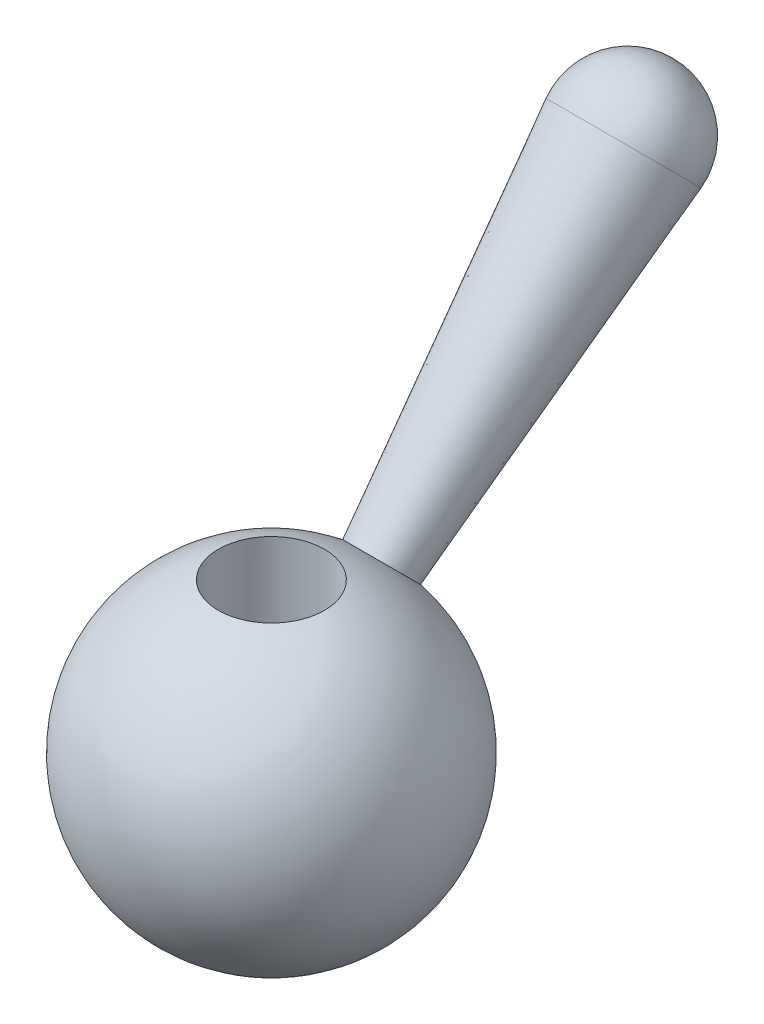
ISO-10303-21;
HEADER;
FILE_DESCRIPTION(('STEP AP214'),'2;1');
FILE_NAME('part.step','',(''),(''),'','','');
FILE_SCHEMA(('AUTOMOTIVE_DESIGN { 1 0 10303 214 1 1 1 1 }'));
ENDSEC;
DATA;
#1=APPLICATION_CONTEXT('core data for automotive mechanical design processes');
#2=APPLICATION_PROTOCOL_DEFINITION('international standard','automotive_design',2000,#1);
#3=PRODUCT_CONTEXT('',#1,'mechanical');
#4=PRODUCT('Part','Part','',(#3));
#5=PRODUCT_RELATED_PRODUCT_CATEGORY('part','',(#4));
#6=PRODUCT_DEFINITION_FORMATION('','',#4);
#7=PRODUCT_DEFINITION_CONTEXT('part definition',#1,'design');
#8=PRODUCT_DEFINITION('design','',#6,#7);
#9=PRODUCT_DEFINITION_SHAPE('','',#8);
#10=(LENGTH_UNIT() NAMED_UNIT(*) SI_UNIT(.MILLI.,.METRE.));
#11=(NAMED_UNIT(*) PLANE_ANGLE_UNIT() SI_UNIT($,.RADIAN.));
#12=(NAMED_UNIT(*) SI_UNIT($,.STERADIAN.) SOLID_ANGLE_UNIT());
#13=UNCERTAINTY_MEASURE_WITH_UNIT(LENGTH_MEASURE(1.E-05),#10,'distance_accuracy_value','');
#14=(GEOMETRIC_REPRESENTATION_CONTEXT(3) GLOBAL_UNCERTAINTY_ASSIGNED_CONTEXT((#13)) GLOBAL_UNIT_ASSIGNED_CONTEXT((#10,
#11,#12)) REPRESENTATION_CONTEXT('',''));
#15=CARTESIAN_POINT('',(0.,0.,0.));
#16=DIRECTION('',(0.,0.,1.));
#17=DIRECTION('',(1.,0.,0.));
#18=AXIS2_PLACEMENT_3D('',#15,#16,#17);
#19=CARTESIAN_POINT('',(0.,0.,0.));
#20=DIRECTION('',(0.,1.,0.));
#21=DIRECTION('',(1.,0.,0.));
#22=AXIS2_PLACEMENT_3D('',#19,#20,#21);
#23=SPHERICAL_SURFACE('',#22,30.);
#24=CARTESIAN_POINT('',(0.,20.7846096908265,-20.7846096908265));
#25=DIRECTION('',(0.,-0.707106781186549,0.707106781186546));
#26=DIRECTION('',(0.,-0.707106781186546,-0.707106781186549));
#27=AXIS2_PLACEMENT_3D('',#24,#25,#26);
#28=CIRCLE('',#27,6.);
#29=CARTESIAN_POINT('',(0.,16.5419690037072,-25.0272503779458));
#30=VERTEX_POINT('',#29);
#31=EDGE_CURVE('E53',#30,#30,#28,.T.);
#32=ORIENTED_EDGE('',*,*,#31,.T.);
#33=EDGE_LOOP('',(#32));
#34=FACE_BOUND('',#33,.T.);
#35=CARTESIAN_POINT('',(0.,28.2842712474619,0.));
#36=DIRECTION('',(0.,-1.,0.));
#37=DIRECTION('',(0.,0.,-1.));
#38=AXIS2_PLACEMENT_3D('',#35,#36,#37);
#39=CIRCLE('',#38,10.);
#40=CARTESIAN_POINT('',(0.,28.2842712474619,-10.));
#41=VERTEX_POINT('',#40);
#42=EDGE_CURVE('E10',#41,#41,#39,.T.);
#43=ORIENTED_EDGE('',*,*,#42,.T.);
#44=EDGE_LOOP('',(#43));
#45=FACE_BOUND('',#44,.T.);
#46=CARTESIAN_POINT('',(0.,-28.2842712474619,0.));
#47=DIRECTION('',(0.,1.,0.));
#48=DIRECTION('',(0.,0.,1.));
#49=AXIS2_PLACEMENT_3D('',#46,#47,#48);
#50=CIRCLE('',#49,10.);
#51=CARTESIAN_POINT('',(0.,-28.2842712474619,10.));
#52=VERTEX_POINT('',#51);
#53=EDGE_CURVE('E48',#52,#52,#50,.T.);
#54=ORIENTED_EDGE('',*,*,#53,.T.);
#55=EDGE_LOOP('',(#54));
#56=FACE_BOUND('',#55,.T.);
#57=ADVANCED_FACE('F41',(#34,#45,#56),#23,.T.);
#58=CARTESIAN_POINT('',(0.,-30.,0.));
#59=DIRECTION('',(0.,1.,0.));
#60=DIRECTION('',(0.,0.,1.));
#61=AXIS2_PLACEMENT_3D('',#58,#59,#60);
#62=CYLINDRICAL_SURFACE('',#61,10.);
#63=ORIENTED_EDGE('',*,*,#53,.F.);
#64=EDGE_LOOP('',(#63));
#65=FACE_BOUND('',#64,.T.);
#66=ORIENTED_EDGE('',*,*,#42,.F.);
#67=EDGE_LOOP('',(#66));
#68=FACE_BOUND('',#67,.T.);
#69=ADVANCED_FACE('F74',(#65,#68),#62,.F.);
#70=CARTESIAN_POINT('',(0.,20.7846096908265,-20.7846096908265));
#71=DIRECTION('',(0.,0.707106781186549,-0.707106781186546));
#72=DIRECTION('',(0.,0.707106781186546,0.707106781186549));
#73=AXIS2_PLACEMENT_3D('',#70,#71,#72);
#74=CONICAL_SURFACE('',#73,6.,0.091971002623712);
#75=CARTESIAN_POINT('',(0.,66.395844102147,-66.3958441021468));
#76=DIRECTION('',(0.,-0.707106781186549,0.707106781186546));
#77=DIRECTION('',(0.,-0.707106781186546,-0.707106781186549));
#78=AXIS2_PLACEMENT_3D('',#75,#76,#77);
#79=CIRCLE('',#78,11.9492837724826);
#80=CARTESIAN_POINT('',(0.,57.9464245163022,-74.8452636879916));
#81=VERTEX_POINT('',#80);
#82=EDGE_CURVE('E58',#81,#81,#79,.T.);
#83=ORIENTED_EDGE('',*,*,#82,.T.);
#84=EDGE_LOOP('',(#83));
#85=FACE_BOUND('',#84,.T.);
#86=ORIENTED_EDGE('',*,*,#31,.F.);
#87=EDGE_LOOP('',(#86));
#88=FACE_BOUND('',#87,.T.);
#89=ADVANCED_FACE('F65',(#85,#88),#74,.T.);
#90=CARTESIAN_POINT('',(0.,67.1751442127221,-67.1751442127219));
#91=DIRECTION('',(0.,-0.707106781186549,0.707106781186546));
#92=DIRECTION('',(0.,-0.707106781186546,-0.707106781186549));
#93=AXIS2_PLACEMENT_3D('',#90,#91,#92);
#94=SPHERICAL_SURFACE('',#93,12.);
#95=ORIENTED_EDGE('',*,*,#82,.F.);
#96=EDGE_LOOP('',(#95));
#97=FACE_BOUND('',#96,.T.);
#98=ADVANCED_FACE('F68',(#97),#94,.T.);
#99=CLOSED_SHELL('',(#57,#69,#89,#98));
#100=MANIFOLD_SOLID_BREP('B2',#99);
#101=ADVANCED_BREP_SHAPE_REPRESENTATION('',(#18,#100),#14);
#102=SHAPE_DEFINITION_REPRESENTATION(#9,#101);
ENDSEC;
END-ISO-10303-21;
